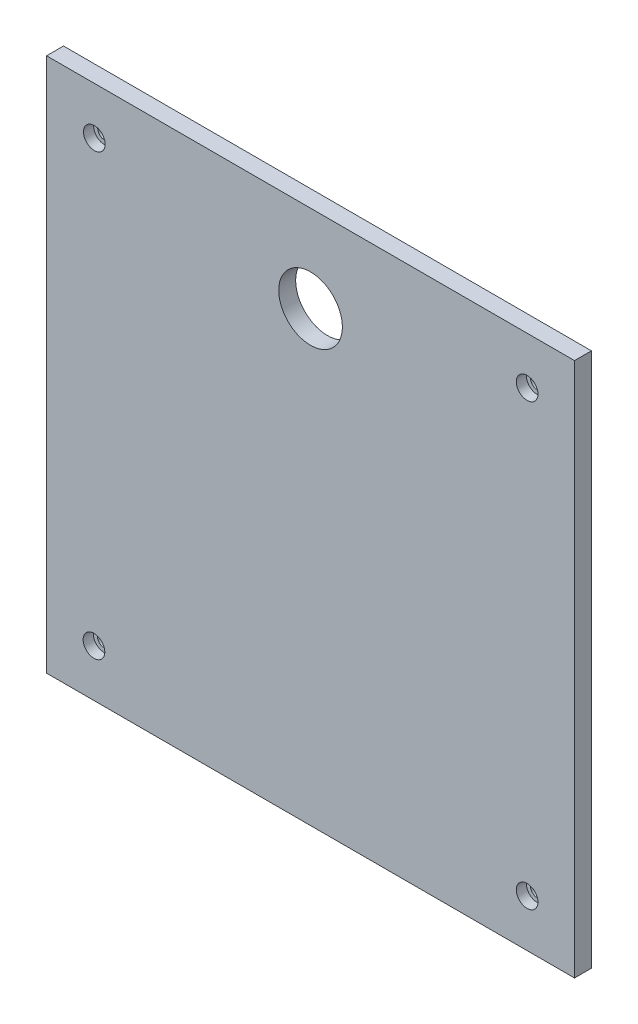
ISO-10303-21;
HEADER;
FILE_DESCRIPTION(('STEP AP214'),'2;1');
FILE_NAME('part.step','',(''),(''),'','','');
FILE_SCHEMA(('AUTOMOTIVE_DESIGN { 1 0 10303 214 1 1 1 1 }'));
ENDSEC;
DATA;
#1=APPLICATION_CONTEXT('core data for automotive mechanical design processes');
#2=APPLICATION_PROTOCOL_DEFINITION('international standard','automotive_design',2000,#1);
#3=PRODUCT_CONTEXT('',#1,'mechanical');
#4=PRODUCT('Part','Part','',(#3));
#5=PRODUCT_RELATED_PRODUCT_CATEGORY('part','',(#4));
#6=PRODUCT_DEFINITION_FORMATION('','',#4);
#7=PRODUCT_DEFINITION_CONTEXT('part definition',#1,'design');
#8=PRODUCT_DEFINITION('design','',#6,#7);
#9=PRODUCT_DEFINITION_SHAPE('','',#8);
#10=(LENGTH_UNIT() NAMED_UNIT(*) SI_UNIT(.MILLI.,.METRE.));
#11=(NAMED_UNIT(*) PLANE_ANGLE_UNIT() SI_UNIT($,.RADIAN.));
#12=(NAMED_UNIT(*) SI_UNIT($,.STERADIAN.) SOLID_ANGLE_UNIT());
#13=UNCERTAINTY_MEASURE_WITH_UNIT(LENGTH_MEASURE(1.E-05),#10,'distance_accuracy_value','');
#14=(GEOMETRIC_REPRESENTATION_CONTEXT(3) GLOBAL_UNCERTAINTY_ASSIGNED_CONTEXT((#13)) GLOBAL_UNIT_ASSIGNED_CONTEXT((#10,
#11,#12)) REPRESENTATION_CONTEXT('',''));
#15=CARTESIAN_POINT('',(0.,0.,0.));
#16=DIRECTION('',(0.,0.,1.));
#17=DIRECTION('',(1.,0.,0.));
#18=AXIS2_PLACEMENT_3D('',#15,#16,#17);
#19=CARTESIAN_POINT('',(-30.1797592776279,31.4921412955825,2.501));
#20=DIRECTION('',(0.,0.,-1.));
#21=DIRECTION('',(-1.,0.,0.));
#22=AXIS2_PLACEMENT_3D('',#19,#20,#21);
#23=CYLINDRICAL_SURFACE('',#22,1.00000254000508);
#24=CARTESIAN_POINT('',(-30.1797592776279,31.4921412955825,0.));
#25=DIRECTION('',(0.,0.,1.));
#26=DIRECTION('',(1.,0.,0.));
#27=AXIS2_PLACEMENT_3D('',#24,#25,#26);
#28=CIRCLE('',#27,1.00000254000508);
#29=CARTESIAN_POINT('',(-29.1797567376228,31.4921412955825,0.));
#30=VERTEX_POINT('',#29);
#31=EDGE_CURVE('E160',#30,#30,#28,.T.);
#32=ORIENTED_EDGE('',*,*,#31,.F.);
#33=EDGE_LOOP('',(#32));
#34=FACE_BOUND('',#33,.T.);
#35=CARTESIAN_POINT('',(-30.1797592776279,31.4921412955825,1.));
#36=DIRECTION('',(0.,0.,1.));
#37=DIRECTION('',(1.,0.,0.));
#38=AXIS2_PLACEMENT_3D('',#35,#36,#37);
#39=CIRCLE('',#38,1.00000254000508);
#40=CARTESIAN_POINT('',(-29.1797567376228,31.4921412955825,1.));
#41=VERTEX_POINT('',#40);
#42=EDGE_CURVE('E207',#41,#41,#39,.T.);
#43=ORIENTED_EDGE('',*,*,#42,.T.);
#44=EDGE_LOOP('',(#43));
#45=FACE_BOUND('',#44,.T.);
#46=ADVANCED_FACE('F33',(#34,#45),#23,.F.);
#47=CARTESIAN_POINT('',(-30.2361423103939,-33.5078485443972,2.501));
#48=DIRECTION('',(0.,0.,-1.));
#49=DIRECTION('',(-1.,0.,0.));
#50=AXIS2_PLACEMENT_3D('',#47,#48,#49);
#51=CYLINDRICAL_SURFACE('',#50,1.00000254000508);
#52=CARTESIAN_POINT('',(-30.2361423103939,-33.5078485443972,0.));
#53=DIRECTION('',(0.,0.,1.));
#54=DIRECTION('',(1.,0.,0.));
#55=AXIS2_PLACEMENT_3D('',#52,#53,#54);
#56=CIRCLE('',#55,1.00000254000508);
#57=CARTESIAN_POINT('',(-29.2361397703889,-33.5078485443972,0.));
#58=VERTEX_POINT('',#57);
#59=EDGE_CURVE('E157',#58,#58,#56,.T.);
#60=ORIENTED_EDGE('',*,*,#59,.F.);
#61=EDGE_LOOP('',(#60));
#62=FACE_BOUND('',#61,.T.);
#63=CARTESIAN_POINT('',(-30.2361423103939,-33.5078485443972,1.));
#64=DIRECTION('',(0.,0.,1.));
#65=DIRECTION('',(1.,0.,0.));
#66=AXIS2_PLACEMENT_3D('',#63,#64,#65);
#67=CIRCLE('',#66,1.00000254000508);
#68=CARTESIAN_POINT('',(-29.2361397703889,-33.5078485443972,1.));
#69=VERTEX_POINT('',#68);
#70=EDGE_CURVE('E204',#69,#69,#67,.T.);
#71=ORIENTED_EDGE('',*,*,#70,.T.);
#72=EDGE_LOOP('',(#71));
#73=FACE_BOUND('',#72,.T.);
#74=ADVANCED_FACE('F254',(#62,#73),#51,.F.);
#75=CARTESIAN_POINT('',(33.7639872298651,-33.5078485442372,2.501));
#76=DIRECTION('',(0.,0.,-1.));
#77=DIRECTION('',(-1.,0.,0.));
#78=AXIS2_PLACEMENT_3D('',#75,#76,#77);
#79=CYLINDRICAL_SURFACE('',#78,1.00000254000507);
#80=CARTESIAN_POINT('',(33.7639872298651,-33.5078485442372,0.));
#81=DIRECTION('',(0.,0.,1.));
#82=DIRECTION('',(1.,0.,0.));
#83=AXIS2_PLACEMENT_3D('',#80,#81,#82);
#84=CIRCLE('',#83,1.00000254000507);
#85=CARTESIAN_POINT('',(34.7639897698702,-33.5078485442372,0.));
#86=VERTEX_POINT('',#85);
#87=EDGE_CURVE('E161',#86,#86,#84,.T.);
#88=ORIENTED_EDGE('',*,*,#87,.F.);
#89=EDGE_LOOP('',(#88));
#90=FACE_BOUND('',#89,.T.);
#91=CARTESIAN_POINT('',(33.7639872298651,-33.5078485442372,1.));
#92=DIRECTION('',(0.,0.,1.));
#93=DIRECTION('',(1.,0.,0.));
#94=AXIS2_PLACEMENT_3D('',#91,#92,#93);
#95=CIRCLE('',#94,1.00000254000507);
#96=CARTESIAN_POINT('',(34.7639897698702,-33.5078485442372,1.));
#97=VERTEX_POINT('',#96);
#98=EDGE_CURVE('E201',#97,#97,#95,.T.);
#99=ORIENTED_EDGE('',*,*,#98,.T.);
#100=EDGE_LOOP('',(#99));
#101=FACE_BOUND('',#100,.T.);
#102=ADVANCED_FACE('F260',(#90,#101),#79,.F.);
#103=CARTESIAN_POINT('',(33.7639872298651,31.4922835360269,2.501));
#104=DIRECTION('',(0.,0.,-1.));
#105=DIRECTION('',(-1.,0.,0.));
#106=AXIS2_PLACEMENT_3D('',#103,#104,#105);
#107=CYLINDRICAL_SURFACE('',#106,1.00000254000507);
#108=CARTESIAN_POINT('',(33.7639872298651,31.4922835360269,0.));
#109=DIRECTION('',(0.,0.,1.));
#110=DIRECTION('',(1.,0.,0.));
#111=AXIS2_PLACEMENT_3D('',#108,#109,#110);
#112=CIRCLE('',#111,1.00000254000507);
#113=CARTESIAN_POINT('',(34.7639897698702,31.4922835360269,0.));
#114=VERTEX_POINT('',#113);
#115=EDGE_CURVE('E164',#114,#114,#112,.T.);
#116=ORIENTED_EDGE('',*,*,#115,.F.);
#117=EDGE_LOOP('',(#116));
#118=FACE_BOUND('',#117,.T.);
#119=CARTESIAN_POINT('',(33.7639872298651,31.4922835360269,1.));
#120=DIRECTION('',(0.,0.,1.));
#121=DIRECTION('',(1.,0.,0.));
#122=AXIS2_PLACEMENT_3D('',#119,#120,#121);
#123=CIRCLE('',#122,1.00000254000507);
#124=CARTESIAN_POINT('',(34.7639897698702,31.4922835360269,1.));
#125=VERTEX_POINT('',#124);
#126=EDGE_CURVE('E156',#125,#125,#123,.T.);
#127=ORIENTED_EDGE('',*,*,#126,.T.);
#128=EDGE_LOOP('',(#127));
#129=FACE_BOUND('',#128,.T.);
#130=ADVANCED_FACE('F317',(#118,#129),#107,.F.);
#131=CARTESIAN_POINT('',(-37.2360775402644,-40.5078587044175,2.5));
#132=DIRECTION('',(-1.,0.,0.));
#133=DIRECTION('',(0.,0.,1.));
#134=AXIS2_PLACEMENT_3D('',#131,#132,#133);
#135=PLANE('',#134);
#136=DIRECTION('',(0.,1.,0.));
#137=VECTOR('',#136,1.);
#138=CARTESIAN_POINT('',(-37.2360775402644,-40.5078587044175,0.));
#139=LINE('',#138,#137);
#140=CARTESIAN_POINT('',(-37.2360775402644,-40.5078587044175,0.));
#141=VERTEX_POINT('',#140);
#142=CARTESIAN_POINT('',(-37.2360775402644,38.4921412955825,0.));
#143=VERTEX_POINT('',#142);
#144=EDGE_CURVE('E175',#141,#143,#139,.T.);
#145=ORIENTED_EDGE('',*,*,#144,.F.);
#146=DIRECTION('',(0.,0.,-1.));
#147=VECTOR('',#146,1.);
#148=CARTESIAN_POINT('',(-37.2360775402644,-40.5078587044175,2.5));
#149=LINE('',#148,#147);
#150=CARTESIAN_POINT('',(-37.2360775402644,-40.5078587044175,2.5));
#151=VERTEX_POINT('',#150);
#152=EDGE_CURVE('E11',#151,#141,#149,.T.);
#153=ORIENTED_EDGE('',*,*,#152,.F.);
#154=DIRECTION('',(0.,1.,0.));
#155=VECTOR('',#154,1.);
#156=CARTESIAN_POINT('',(-37.2360775402644,-40.5078587044175,2.5));
#157=LINE('',#156,#155);
#158=CARTESIAN_POINT('',(-37.2360775402644,38.4921412955825,2.5));
#159=VERTEX_POINT('',#158);
#160=EDGE_CURVE('E176',#151,#159,#157,.T.);
#161=ORIENTED_EDGE('',*,*,#160,.T.);
#162=DIRECTION('',(0.,0.,-1.));
#163=VECTOR('',#162,1.);
#164=CARTESIAN_POINT('',(-37.2360775402644,38.4921412955825,2.5));
#165=LINE('',#164,#163);
#166=EDGE_CURVE('E82',#159,#143,#165,.T.);
#167=ORIENTED_EDGE('',*,*,#166,.T.);
#168=EDGE_LOOP('',(#145,#153,#161,#167));
#169=FACE_BOUND('',#168,.T.);
#170=ADVANCED_FACE('F35',(#169),#135,.T.);
#171=CARTESIAN_POINT('',(-37.2360775402644,-40.5078587044175,2.5));
#172=DIRECTION('',(0.,1.,0.));
#173=DIRECTION('',(0.,0.,1.));
#174=AXIS2_PLACEMENT_3D('',#171,#172,#173);
#175=PLANE('',#174);
#176=DIRECTION('',(1.,0.,0.));
#177=VECTOR('',#176,1.);
#178=CARTESIAN_POINT('',(-37.2360775402644,-40.5078587044175,0.));
#179=LINE('',#178,#177);
#180=CARTESIAN_POINT('',(40.7639224597356,-40.5078587044175,0.));
#181=VERTEX_POINT('',#180);
#182=EDGE_CURVE('E179',#141,#181,#179,.T.);
#183=ORIENTED_EDGE('',*,*,#182,.T.);
#184=DIRECTION('',(0.,0.,-1.));
#185=VECTOR('',#184,1.);
#186=CARTESIAN_POINT('',(40.7639224597356,-40.5078587044175,2.5));
#187=LINE('',#186,#185);
#188=CARTESIAN_POINT('',(40.7639224597356,-40.5078587044175,2.5));
#189=VERTEX_POINT('',#188);
#190=EDGE_CURVE('E42',#189,#181,#187,.T.);
#191=ORIENTED_EDGE('',*,*,#190,.F.);
#192=DIRECTION('',(1.,0.,0.));
#193=VECTOR('',#192,1.);
#194=CARTESIAN_POINT('',(-37.2360775402644,-40.5078587044175,2.5));
#195=LINE('',#194,#193);
#196=EDGE_CURVE('E183',#151,#189,#195,.T.);
#197=ORIENTED_EDGE('',*,*,#196,.F.);
#198=ORIENTED_EDGE('',*,*,#152,.T.);
#199=EDGE_LOOP('',(#183,#191,#197,#198));
#200=FACE_BOUND('',#199,.T.);
#201=ADVANCED_FACE('F242',(#200),#175,.F.);
#202=CARTESIAN_POINT('',(40.7639224597356,-40.5078587044175,2.5));
#203=DIRECTION('',(-1.,0.,0.));
#204=DIRECTION('',(0.,0.,1.));
#205=AXIS2_PLACEMENT_3D('',#202,#203,#204);
#206=PLANE('',#205);
#207=DIRECTION('',(0.,1.,0.));
#208=VECTOR('',#207,1.);
#209=CARTESIAN_POINT('',(40.7639224597356,-40.5078587044175,0.));
#210=LINE('',#209,#208);
#211=CARTESIAN_POINT('',(40.7639224597356,38.4921412955825,0.));
#212=VERTEX_POINT('',#211);
#213=EDGE_CURVE('E190',#181,#212,#210,.T.);
#214=ORIENTED_EDGE('',*,*,#213,.T.);
#215=DIRECTION('',(0.,0.,-1.));
#216=VECTOR('',#215,1.);
#217=CARTESIAN_POINT('',(40.7639224597356,38.4921412955825,2.5));
#218=LINE('',#217,#216);
#219=CARTESIAN_POINT('',(40.7639224597356,38.4921412955825,2.5));
#220=VERTEX_POINT('',#219);
#221=EDGE_CURVE('E196',#220,#212,#218,.T.);
#222=ORIENTED_EDGE('',*,*,#221,.F.);
#223=DIRECTION('',(0.,1.,0.));
#224=VECTOR('',#223,1.);
#225=CARTESIAN_POINT('',(40.7639224597356,-40.5078587044175,2.5));
#226=LINE('',#225,#224);
#227=EDGE_CURVE('E181',#189,#220,#226,.T.);
#228=ORIENTED_EDGE('',*,*,#227,.F.);
#229=ORIENTED_EDGE('',*,*,#190,.T.);
#230=EDGE_LOOP('',(#214,#222,#228,#229));
#231=FACE_BOUND('',#230,.T.);
#232=ADVANCED_FACE('F245',(#231),#206,.F.);
#233=CARTESIAN_POINT('',(-37.2360775402644,38.4921412955825,2.5));
#234=DIRECTION('',(0.,1.,0.));
#235=DIRECTION('',(0.,0.,1.));
#236=AXIS2_PLACEMENT_3D('',#233,#234,#235);
#237=PLANE('',#236);
#238=DIRECTION('',(1.,0.,0.));
#239=VECTOR('',#238,1.);
#240=CARTESIAN_POINT('',(-37.2360775402644,38.4921412955825,0.));
#241=LINE('',#240,#239);
#242=EDGE_CURVE('E187',#143,#212,#241,.T.);
#243=ORIENTED_EDGE('',*,*,#242,.F.);
#244=ORIENTED_EDGE('',*,*,#166,.F.);
#245=DIRECTION('',(1.,0.,0.));
#246=VECTOR('',#245,1.);
#247=CARTESIAN_POINT('',(-37.2360775402644,38.4921412955825,2.5));
#248=LINE('',#247,#246);
#249=EDGE_CURVE('E178',#159,#220,#248,.T.);
#250=ORIENTED_EDGE('',*,*,#249,.T.);
#251=ORIENTED_EDGE('',*,*,#221,.T.);
#252=EDGE_LOOP('',(#243,#244,#250,#251));
#253=FACE_BOUND('',#252,.T.);
#254=ADVANCED_FACE('F228',(#253),#237,.T.);
#255=CARTESIAN_POINT('',(0.,0.,2.5));
#256=DIRECTION('',(0.,0.,-1.));
#257=DIRECTION('',(-1.,0.,0.));
#258=AXIS2_PLACEMENT_3D('',#255,#256,#257);
#259=PLANE('',#258);
#260=CARTESIAN_POINT('',(-30.2361423103939,-33.5078485443972,2.5));
#261=DIRECTION('',(0.,0.,-1.));
#262=DIRECTION('',(-1.,0.,0.));
#263=AXIS2_PLACEMENT_3D('',#260,#261,#262);
#264=CIRCLE('',#263,1.6);
#265=CARTESIAN_POINT('',(-31.8361423103939,-33.5078485443972,2.5));
#266=VERTEX_POINT('',#265);
#267=EDGE_CURVE('E37',#266,#266,#264,.F.);
#268=ORIENTED_EDGE('',*,*,#267,.F.);
#269=EDGE_LOOP('',(#268));
#270=FACE_BOUND('',#269,.T.);
#271=CARTESIAN_POINT('',(33.7639872298651,-33.5078485442372,2.5));
#272=DIRECTION('',(0.,0.,-1.));
#273=DIRECTION('',(-1.,0.,0.));
#274=AXIS2_PLACEMENT_3D('',#271,#272,#273);
#275=CIRCLE('',#274,1.6);
#276=CARTESIAN_POINT('',(32.1639872298651,-33.5078485442372,2.5));
#277=VERTEX_POINT('',#276);
#278=EDGE_CURVE('E215',#277,#277,#275,.F.);
#279=ORIENTED_EDGE('',*,*,#278,.F.);
#280=EDGE_LOOP('',(#279));
#281=FACE_BOUND('',#280,.T.);
#282=CARTESIAN_POINT('',(33.7639872298651,31.4922835360269,2.5));
#283=DIRECTION('',(0.,0.,-1.));
#284=DIRECTION('',(-1.,0.,0.));
#285=AXIS2_PLACEMENT_3D('',#282,#283,#284);
#286=CIRCLE('',#285,1.6);
#287=CARTESIAN_POINT('',(32.1639872298651,31.4922835360269,2.5));
#288=VERTEX_POINT('',#287);
#289=EDGE_CURVE('E213',#288,#288,#286,.F.);
#290=ORIENTED_EDGE('',*,*,#289,.F.);
#291=EDGE_LOOP('',(#290));
#292=FACE_BOUND('',#291,.T.);
#293=CARTESIAN_POINT('',(-30.1797592776279,31.4921412955825,2.5));
#294=DIRECTION('',(0.,0.,-1.));
#295=DIRECTION('',(-1.,0.,0.));
#296=AXIS2_PLACEMENT_3D('',#293,#294,#295);
#297=CIRCLE('',#296,1.6);
#298=CARTESIAN_POINT('',(-31.7797592776279,31.4921412955825,2.5));
#299=VERTEX_POINT('',#298);
#300=EDGE_CURVE('E210',#299,#299,#297,.F.);
#301=ORIENTED_EDGE('',*,*,#300,.F.);
#302=EDGE_LOOP('',(#301));
#303=FACE_BOUND('',#302,.T.);
#304=CARTESIAN_POINT('',(1.7641145108813,25.6390820646259,2.5));
#305=DIRECTION('',(0.,0.,-1.));
#306=DIRECTION('',(-1.,0.,0.));
#307=AXIS2_PLACEMENT_3D('',#304,#305,#306);
#308=CIRCLE('',#307,4.7);
#309=CARTESIAN_POINT('',(-2.9358854891187,25.6390820646259,2.5));
#310=VERTEX_POINT('',#309);
#311=EDGE_CURVE('E167',#310,#310,#308,.T.);
#312=ORIENTED_EDGE('',*,*,#311,.T.);
#313=EDGE_LOOP('',(#312));
#314=FACE_BOUND('',#313,.T.);
#315=ORIENTED_EDGE('',*,*,#160,.F.);
#316=ORIENTED_EDGE('',*,*,#196,.T.);
#317=ORIENTED_EDGE('',*,*,#227,.T.);
#318=ORIENTED_EDGE('',*,*,#249,.F.);
#319=EDGE_LOOP('',(#315,#316,#317,#318));
#320=FACE_BOUND('',#319,.T.);
#321=ADVANCED_FACE('F224',(#270,#281,#292,#303,#314,#320),#259,.F.);
#322=CARTESIAN_POINT('',(0.,0.,0.));
#323=DIRECTION('',(0.,0.,-1.));
#324=DIRECTION('',(-1.,0.,0.));
#325=AXIS2_PLACEMENT_3D('',#322,#323,#324);
#326=PLANE('',#325);
#327=DIRECTION('',(0.,1.,0.));
#328=VECTOR('',#327,1.);
#329=CARTESIAN_POINT('',(-27.2360775402644,19.4390820646259,0.));
#330=LINE('',#329,#328);
#331=CARTESIAN_POINT('',(-27.2360775402644,-29.5078460042322,0.));
#332=VERTEX_POINT('',#331);
#333=CARTESIAN_POINT('',(-27.2360775402644,19.4390820646259,0.));
#334=VERTEX_POINT('',#333);
#335=EDGE_CURVE('E50',#332,#334,#330,.T.);
#336=ORIENTED_EDGE('',*,*,#335,.F.);
#337=DIRECTION('',(-1.,0.,0.));
#338=VECTOR('',#337,1.);
#339=CARTESIAN_POINT('',(-27.2360775402644,-29.5078460042322,0.));
#340=LINE('',#339,#338);
#341=CARTESIAN_POINT('',(29.7639846898601,-29.5078460042322,0.));
#342=VERTEX_POINT('',#341);
#343=EDGE_CURVE('E126',#342,#332,#340,.T.);
#344=ORIENTED_EDGE('',*,*,#343,.F.);
#345=DIRECTION('',(0.,-1.,0.));
#346=VECTOR('',#345,1.);
#347=CARTESIAN_POINT('',(29.7639846898601,19.4390820646259,0.));
#348=LINE('',#347,#346);
#349=CARTESIAN_POINT('',(29.7639846898601,19.4390820646259,0.));
#350=VERTEX_POINT('',#349);
#351=EDGE_CURVE('E129',#350,#342,#348,.T.);
#352=ORIENTED_EDGE('',*,*,#351,.F.);
#353=DIRECTION('',(1.,0.,0.));
#354=VECTOR('',#353,1.);
#355=CARTESIAN_POINT('',(-27.2360775402644,19.4390820646259,0.));
#356=LINE('',#355,#354);
#357=EDGE_CURVE('E135',#334,#350,#356,.T.);
#358=ORIENTED_EDGE('',*,*,#357,.F.);
#359=EDGE_LOOP('',(#336,#344,#352,#358));
#360=FACE_BOUND('',#359,.T.);
#361=CARTESIAN_POINT('',(1.7641145108813,25.6390820646259,0.));
#362=DIRECTION('',(0.,0.,1.));
#363=DIRECTION('',(1.,0.,0.));
#364=AXIS2_PLACEMENT_3D('',#361,#362,#363);
#365=CIRCLE('',#364,4.7);
#366=CARTESIAN_POINT('',(6.4641145108813,25.6390820646259,0.));
#367=VERTEX_POINT('',#366);
#368=EDGE_CURVE('E170',#367,#367,#365,.T.);
#369=ORIENTED_EDGE('',*,*,#368,.T.);
#370=EDGE_LOOP('',(#369));
#371=FACE_BOUND('',#370,.T.);
#372=ORIENTED_EDGE('',*,*,#115,.T.);
#373=EDGE_LOOP('',(#372));
#374=FACE_BOUND('',#373,.T.);
#375=ORIENTED_EDGE('',*,*,#87,.T.);
#376=EDGE_LOOP('',(#375));
#377=FACE_BOUND('',#376,.T.);
#378=ORIENTED_EDGE('',*,*,#59,.T.);
#379=EDGE_LOOP('',(#378));
#380=FACE_BOUND('',#379,.T.);
#381=ORIENTED_EDGE('',*,*,#31,.T.);
#382=EDGE_LOOP('',(#381));
#383=FACE_BOUND('',#382,.T.);
#384=ORIENTED_EDGE('',*,*,#144,.T.);
#385=ORIENTED_EDGE('',*,*,#242,.T.);
#386=ORIENTED_EDGE('',*,*,#213,.F.);
#387=ORIENTED_EDGE('',*,*,#182,.F.);
#388=EDGE_LOOP('',(#384,#385,#386,#387));
#389=FACE_BOUND('',#388,.T.);
#390=ADVANCED_FACE('F227',(#360,#371,#374,#377,#380,#383,#389),#326,.T.);
#391=CARTESIAN_POINT('',(1.7641145108813,25.6390820646259,2.501));
#392=DIRECTION('',(0.,0.,-1.));
#393=DIRECTION('',(-1.,0.,0.));
#394=AXIS2_PLACEMENT_3D('',#391,#392,#393);
#395=CYLINDRICAL_SURFACE('',#394,4.7);
#396=ORIENTED_EDGE('',*,*,#368,.F.);
#397=EDGE_LOOP('',(#396));
#398=FACE_BOUND('',#397,.T.);
#399=ORIENTED_EDGE('',*,*,#311,.F.);
#400=EDGE_LOOP('',(#399));
#401=FACE_BOUND('',#400,.T.);
#402=ADVANCED_FACE('F266',(#398,#401),#395,.F.);
#403=CARTESIAN_POINT('',(33.7639872298651,31.4922835360269,3.5));
#404=DIRECTION('',(0.,0.,-1.));
#405=DIRECTION('',(-1.,0.,0.));
#406=AXIS2_PLACEMENT_3D('',#403,#404,#405);
#407=CYLINDRICAL_SURFACE('',#406,1.6);
#408=CARTESIAN_POINT('',(33.7639872298651,31.4922835360269,1.));
#409=DIRECTION('',(0.,0.,1.));
#410=DIRECTION('',(1.,0.,0.));
#411=AXIS2_PLACEMENT_3D('',#408,#409,#410);
#412=CIRCLE('',#411,1.6);
#413=CARTESIAN_POINT('',(35.3639872298651,31.4922835360269,1.));
#414=VERTEX_POINT('',#413);
#415=EDGE_CURVE('E145',#414,#414,#412,.T.);
#416=ORIENTED_EDGE('',*,*,#415,.F.);
#417=EDGE_LOOP('',(#416));
#418=FACE_BOUND('',#417,.T.);
#419=ORIENTED_EDGE('',*,*,#289,.T.);
#420=EDGE_LOOP('',(#419));
#421=FACE_BOUND('',#420,.T.);
#422=ADVANCED_FACE('F276',(#418,#421),#407,.F.);
#423=CARTESIAN_POINT('',(33.7639872298651,31.4922835360269,1.));
#424=DIRECTION('',(0.,0.,1.));
#425=DIRECTION('',(1.,0.,0.));
#426=AXIS2_PLACEMENT_3D('',#423,#424,#425);
#427=PLANE('',#426);
#428=ORIENTED_EDGE('',*,*,#126,.F.);
#429=EDGE_LOOP('',(#428));
#430=FACE_BOUND('',#429,.T.);
#431=ORIENTED_EDGE('',*,*,#415,.T.);
#432=EDGE_LOOP('',(#431));
#433=FACE_BOUND('',#432,.T.);
#434=ADVANCED_FACE('F327',(#430,#433),#427,.T.);
#435=CARTESIAN_POINT('',(33.7639872298651,-33.5078485442372,3.5));
#436=DIRECTION('',(0.,0.,-1.));
#437=DIRECTION('',(-1.,0.,0.));
#438=AXIS2_PLACEMENT_3D('',#435,#436,#437);
#439=CYLINDRICAL_SURFACE('',#438,1.6);
#440=CARTESIAN_POINT('',(33.7639872298651,-33.5078485442372,1.));
#441=DIRECTION('',(0.,0.,1.));
#442=DIRECTION('',(1.,0.,0.));
#443=AXIS2_PLACEMENT_3D('',#440,#441,#442);
#444=CIRCLE('',#443,1.6);
#445=CARTESIAN_POINT('',(35.3639872298651,-33.5078485442372,1.));
#446=VERTEX_POINT('',#445);
#447=EDGE_CURVE('E149',#446,#446,#444,.T.);
#448=ORIENTED_EDGE('',*,*,#447,.F.);
#449=EDGE_LOOP('',(#448));
#450=FACE_BOUND('',#449,.T.);
#451=ORIENTED_EDGE('',*,*,#278,.T.);
#452=EDGE_LOOP('',(#451));
#453=FACE_BOUND('',#452,.T.);
#454=ADVANCED_FACE('F304',(#450,#453),#439,.F.);
#455=CARTESIAN_POINT('',(33.7639872298651,-33.5078485442372,1.));
#456=DIRECTION('',(0.,0.,1.));
#457=DIRECTION('',(1.,0.,0.));
#458=AXIS2_PLACEMENT_3D('',#455,#456,#457);
#459=PLANE('',#458);
#460=ORIENTED_EDGE('',*,*,#98,.F.);
#461=EDGE_LOOP('',(#460));
#462=FACE_BOUND('',#461,.T.);
#463=ORIENTED_EDGE('',*,*,#447,.T.);
#464=EDGE_LOOP('',(#463));
#465=FACE_BOUND('',#464,.T.);
#466=ADVANCED_FACE('F299',(#462,#465),#459,.T.);
#467=CARTESIAN_POINT('',(-30.2361423103939,-33.5078485443972,3.5));
#468=DIRECTION('',(0.,0.,-1.));
#469=DIRECTION('',(-1.,0.,0.));
#470=AXIS2_PLACEMENT_3D('',#467,#468,#469);
#471=CYLINDRICAL_SURFACE('',#470,1.6);
#472=CARTESIAN_POINT('',(-30.2361423103939,-33.5078485443972,1.));
#473=DIRECTION('',(0.,0.,1.));
#474=DIRECTION('',(1.,0.,0.));
#475=AXIS2_PLACEMENT_3D('',#472,#473,#474);
#476=CIRCLE('',#475,1.6);
#477=CARTESIAN_POINT('',(-28.6361423103939,-33.5078485443972,1.));
#478=VERTEX_POINT('',#477);
#479=EDGE_CURVE('E141',#478,#478,#476,.T.);
#480=ORIENTED_EDGE('',*,*,#479,.F.);
#481=EDGE_LOOP('',(#480));
#482=FACE_BOUND('',#481,.T.);
#483=ORIENTED_EDGE('',*,*,#267,.T.);
#484=EDGE_LOOP('',(#483));
#485=FACE_BOUND('',#484,.T.);
#486=ADVANCED_FACE('F222',(#482,#485),#471,.F.);
#487=CARTESIAN_POINT('',(-30.2361423103939,-33.5078485443972,1.));
#488=DIRECTION('',(0.,0.,1.));
#489=DIRECTION('',(1.,0.,0.));
#490=AXIS2_PLACEMENT_3D('',#487,#488,#489);
#491=PLANE('',#490);
#492=ORIENTED_EDGE('',*,*,#70,.F.);
#493=EDGE_LOOP('',(#492));
#494=FACE_BOUND('',#493,.T.);
#495=ORIENTED_EDGE('',*,*,#479,.T.);
#496=EDGE_LOOP('',(#495));
#497=FACE_BOUND('',#496,.T.);
#498=ADVANCED_FACE('F291',(#494,#497),#491,.T.);
#499=CARTESIAN_POINT('',(-30.1797592776279,31.4921412955825,3.5));
#500=DIRECTION('',(0.,0.,-1.));
#501=DIRECTION('',(-1.,0.,0.));
#502=AXIS2_PLACEMENT_3D('',#499,#500,#501);
#503=CYLINDRICAL_SURFACE('',#502,1.6);
#504=CARTESIAN_POINT('',(-30.1797592776279,31.4921412955825,1.));
#505=DIRECTION('',(0.,0.,1.));
#506=DIRECTION('',(1.,0.,0.));
#507=AXIS2_PLACEMENT_3D('',#504,#505,#506);
#508=CIRCLE('',#507,1.6);
#509=CARTESIAN_POINT('',(-28.5797592776279,31.4921412955825,1.));
#510=VERTEX_POINT('',#509);
#511=EDGE_CURVE('E148',#510,#510,#508,.T.);
#512=ORIENTED_EDGE('',*,*,#511,.F.);
#513=EDGE_LOOP('',(#512));
#514=FACE_BOUND('',#513,.T.);
#515=ORIENTED_EDGE('',*,*,#300,.T.);
#516=EDGE_LOOP('',(#515));
#517=FACE_BOUND('',#516,.T.);
#518=ADVANCED_FACE('F294',(#514,#517),#503,.F.);
#519=CARTESIAN_POINT('',(-30.1797592776279,31.4921412955825,1.));
#520=DIRECTION('',(0.,0.,1.));
#521=DIRECTION('',(1.,0.,0.));
#522=AXIS2_PLACEMENT_3D('',#519,#520,#521);
#523=PLANE('',#522);
#524=ORIENTED_EDGE('',*,*,#42,.F.);
#525=EDGE_LOOP('',(#524));
#526=FACE_BOUND('',#525,.T.);
#527=ORIENTED_EDGE('',*,*,#511,.T.);
#528=EDGE_LOOP('',(#527));
#529=FACE_BOUND('',#528,.T.);
#530=ADVANCED_FACE('F309',(#526,#529),#523,.T.);
#531=CARTESIAN_POINT('',(-27.2360775402644,19.4390820646259,1.));
#532=DIRECTION('',(-1.,0.,0.));
#533=DIRECTION('',(0.,-1.,0.));
#534=AXIS2_PLACEMENT_3D('',#531,#532,#533);
#535=PLANE('',#534);
#536=ORIENTED_EDGE('',*,*,#335,.T.);
#537=DIRECTION('',(0.,0.,-1.));
#538=VECTOR('',#537,1.);
#539=CARTESIAN_POINT('',(-27.2360775402644,19.4390820646259,1.));
#540=LINE('',#539,#538);
#541=CARTESIAN_POINT('',(-27.2360775402644,19.4390820646259,1.));
#542=VERTEX_POINT('',#541);
#543=EDGE_CURVE('E104',#542,#334,#540,.T.);
#544=ORIENTED_EDGE('',*,*,#543,.F.);
#545=DIRECTION('',(0.,1.,0.));
#546=VECTOR('',#545,1.);
#547=CARTESIAN_POINT('',(-27.2360775402644,19.4390820646259,1.));
#548=LINE('',#547,#546);
#549=CARTESIAN_POINT('',(-27.2360775402644,-29.5078460042322,1.));
#550=VERTEX_POINT('',#549);
#551=EDGE_CURVE('E108',#550,#542,#548,.T.);
#552=ORIENTED_EDGE('',*,*,#551,.F.);
#553=DIRECTION('',(0.,0.,-1.));
#554=VECTOR('',#553,1.);
#555=CARTESIAN_POINT('',(-27.2360775402644,-29.5078460042322,1.));
#556=LINE('',#555,#554);
#557=EDGE_CURVE('E139',#550,#332,#556,.T.);
#558=ORIENTED_EDGE('',*,*,#557,.T.);
#559=EDGE_LOOP('',(#536,#544,#552,#558));
#560=FACE_BOUND('',#559,.T.);
#561=ADVANCED_FACE('F106',(#560),#535,.F.);
#562=CARTESIAN_POINT('',(-27.2360775402644,-29.5078460042322,1.));
#563=DIRECTION('',(0.,-1.,0.));
#564=DIRECTION('',(1.,0.,0.));
#565=AXIS2_PLACEMENT_3D('',#562,#563,#564);
#566=PLANE('',#565);
#567=ORIENTED_EDGE('',*,*,#343,.T.);
#568=ORIENTED_EDGE('',*,*,#557,.F.);
#569=DIRECTION('',(-1.,0.,0.));
#570=VECTOR('',#569,1.);
#571=CARTESIAN_POINT('',(-27.2360775402644,-29.5078460042322,1.));
#572=LINE('',#571,#570);
#573=CARTESIAN_POINT('',(29.7639846898601,-29.5078460042322,1.));
#574=VERTEX_POINT('',#573);
#575=EDGE_CURVE('E114',#574,#550,#572,.T.);
#576=ORIENTED_EDGE('',*,*,#575,.F.);
#577=DIRECTION('',(0.,0.,-1.));
#578=VECTOR('',#577,1.);
#579=CARTESIAN_POINT('',(29.7639846898601,-29.5078460042322,1.));
#580=LINE('',#579,#578);
#581=EDGE_CURVE('E142',#574,#342,#580,.T.);
#582=ORIENTED_EDGE('',*,*,#581,.T.);
#583=EDGE_LOOP('',(#567,#568,#576,#582));
#584=FACE_BOUND('',#583,.T.);
#585=ADVANCED_FACE('F381',(#584),#566,.F.);
#586=CARTESIAN_POINT('',(29.7639846898601,19.4390820646259,1.));
#587=DIRECTION('',(1.,0.,0.));
#588=DIRECTION('',(0.,1.,0.));
#589=AXIS2_PLACEMENT_3D('',#586,#587,#588);
#590=PLANE('',#589);
#591=ORIENTED_EDGE('',*,*,#351,.T.);
#592=ORIENTED_EDGE('',*,*,#581,.F.);
#593=DIRECTION('',(0.,-1.,0.));
#594=VECTOR('',#593,1.);
#595=CARTESIAN_POINT('',(29.7639846898601,19.4390820646259,1.));
#596=LINE('',#595,#594);
#597=CARTESIAN_POINT('',(29.7639846898601,19.4390820646259,1.));
#598=VERTEX_POINT('',#597);
#599=EDGE_CURVE('E122',#598,#574,#596,.T.);
#600=ORIENTED_EDGE('',*,*,#599,.F.);
#601=DIRECTION('',(0.,0.,-1.));
#602=VECTOR('',#601,1.);
#603=CARTESIAN_POINT('',(29.7639846898601,19.4390820646259,1.));
#604=LINE('',#603,#602);
#605=EDGE_CURVE('E113',#598,#350,#604,.T.);
#606=ORIENTED_EDGE('',*,*,#605,.T.);
#607=EDGE_LOOP('',(#591,#592,#600,#606));
#608=FACE_BOUND('',#607,.T.);
#609=ADVANCED_FACE('F386',(#608),#590,.F.);
#610=CARTESIAN_POINT('',(-27.2360775402644,19.4390820646259,1.));
#611=DIRECTION('',(0.,1.,0.));
#612=DIRECTION('',(-1.,0.,0.));
#613=AXIS2_PLACEMENT_3D('',#610,#611,#612);
#614=PLANE('',#613);
#615=ORIENTED_EDGE('',*,*,#357,.T.);
#616=ORIENTED_EDGE('',*,*,#605,.F.);
#617=DIRECTION('',(1.,0.,0.));
#618=VECTOR('',#617,1.);
#619=CARTESIAN_POINT('',(-27.2360775402644,19.4390820646259,1.));
#620=LINE('',#619,#618);
#621=EDGE_CURVE('E117',#542,#598,#620,.T.);
#622=ORIENTED_EDGE('',*,*,#621,.F.);
#623=ORIENTED_EDGE('',*,*,#543,.T.);
#624=EDGE_LOOP('',(#615,#616,#622,#623));
#625=FACE_BOUND('',#624,.T.);
#626=ADVANCED_FACE('F118',(#625),#614,.F.);
#627=CARTESIAN_POINT('',(0.,0.,1.));
#628=DIRECTION('',(0.,0.,1.));
#629=DIRECTION('',(1.,0.,0.));
#630=AXIS2_PLACEMENT_3D('',#627,#628,#629);
#631=PLANE('',#630);
#632=ORIENTED_EDGE('',*,*,#551,.T.);
#633=ORIENTED_EDGE('',*,*,#621,.T.);
#634=ORIENTED_EDGE('',*,*,#599,.T.);
#635=ORIENTED_EDGE('',*,*,#575,.T.);
#636=EDGE_LOOP('',(#632,#633,#634,#635));
#637=FACE_BOUND('',#636,.T.);
#638=ADVANCED_FACE('F124',(#637),#631,.F.);
#639=CLOSED_SHELL('',(#46,#74,#102,#130,#170,#201,#232,#254,#321,#390,#402,#422,#434,#454,#466,
#486,#498,#518,#530,#561,#585,#609,#626,#638));
#640=MANIFOLD_SOLID_BREP('B2',#639);
#641=ADVANCED_BREP_SHAPE_REPRESENTATION('',(#18,#640),#14);
#642=SHAPE_DEFINITION_REPRESENTATION(#9,#641);
ENDSEC;
END-ISO-10303-21;
